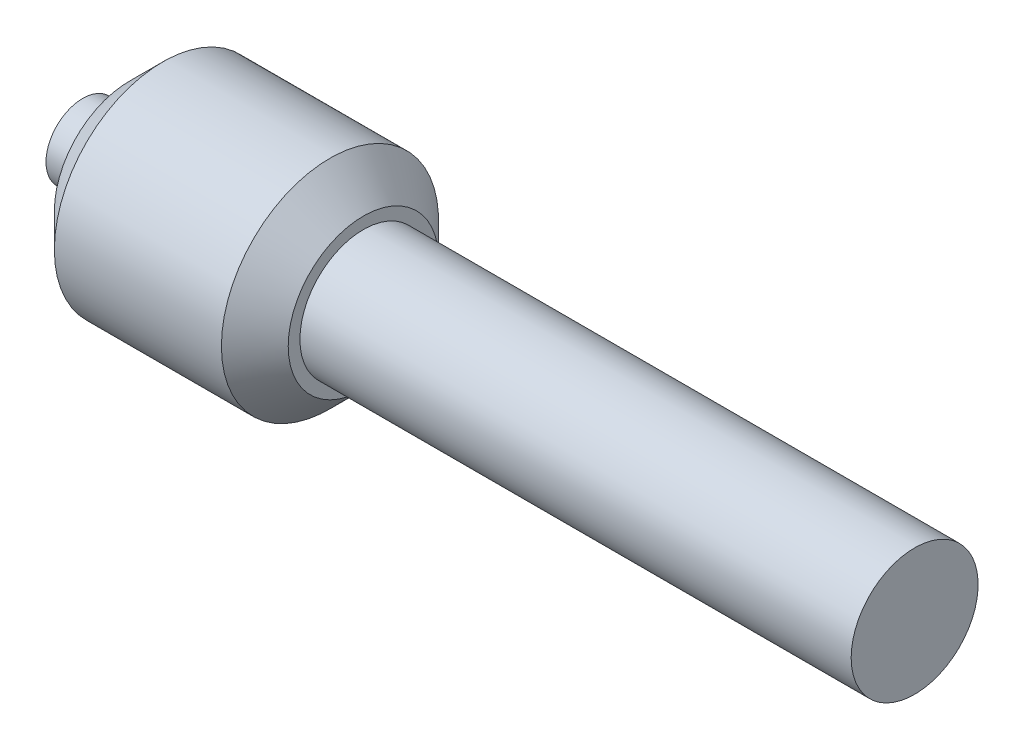
ISO-10303-21;
HEADER;
FILE_DESCRIPTION(('STEP AP214'),'2;1');
FILE_NAME('part.step','',(''),(''),'','','');
FILE_SCHEMA(('AUTOMOTIVE_DESIGN { 1 0 10303 214 1 1 1 1 }'));
ENDSEC;
DATA;
#1=APPLICATION_CONTEXT('core data for automotive mechanical design processes');
#2=APPLICATION_PROTOCOL_DEFINITION('international standard','automotive_design',2000,#1);
#3=PRODUCT_CONTEXT('',#1,'mechanical');
#4=PRODUCT('Part','Part','',(#3));
#5=PRODUCT_RELATED_PRODUCT_CATEGORY('part','',(#4));
#6=PRODUCT_DEFINITION_FORMATION('','',#4);
#7=PRODUCT_DEFINITION_CONTEXT('part definition',#1,'design');
#8=PRODUCT_DEFINITION('design','',#6,#7);
#9=PRODUCT_DEFINITION_SHAPE('','',#8);
#10=(LENGTH_UNIT() NAMED_UNIT(*) SI_UNIT(.MILLI.,.METRE.));
#11=(NAMED_UNIT(*) PLANE_ANGLE_UNIT() SI_UNIT($,.RADIAN.));
#12=(NAMED_UNIT(*) SI_UNIT($,.STERADIAN.) SOLID_ANGLE_UNIT());
#13=UNCERTAINTY_MEASURE_WITH_UNIT(LENGTH_MEASURE(1.E-05),#10,'distance_accuracy_value','');
#14=(GEOMETRIC_REPRESENTATION_CONTEXT(3) GLOBAL_UNCERTAINTY_ASSIGNED_CONTEXT((#13)) GLOBAL_UNIT_ASSIGNED_CONTEXT((#10,
#11,#12)) REPRESENTATION_CONTEXT('',''));
#15=CARTESIAN_POINT('',(0.,0.,0.));
#16=DIRECTION('',(0.,0.,1.));
#17=DIRECTION('',(1.,0.,0.));
#18=AXIS2_PLACEMENT_3D('',#15,#16,#17);
#19=CARTESIAN_POINT('',(0.,11.,0.));
#20=DIRECTION('',(1.,0.,0.));
#21=DIRECTION('',(0.,0.,-1.));
#22=AXIS2_PLACEMENT_3D('',#19,#20,#21);
#23=PLANE('',#22);
#24=CARTESIAN_POINT('',(0.,0.,0.));
#25=DIRECTION('',(-1.,0.,0.));
#26=DIRECTION('',(0.,0.,1.));
#27=AXIS2_PLACEMENT_3D('',#24,#25,#26);
#28=CIRCLE('',#27,6.025);
#29=CARTESIAN_POINT('',(0.,0.,6.025));
#30=VERTEX_POINT('',#29);
#31=EDGE_CURVE('E69',#30,#30,#28,.T.);
#32=ORIENTED_EDGE('',*,*,#31,.F.);
#33=EDGE_LOOP('',(#32));
#34=FACE_BOUND('',#33,.T.);
#35=CARTESIAN_POINT('',(0.,0.,0.));
#36=DIRECTION('',(-1.,0.,0.));
#37=DIRECTION('',(0.,0.,1.));
#38=AXIS2_PLACEMENT_3D('',#35,#36,#37);
#39=CIRCLE('',#38,11.);
#40=CARTESIAN_POINT('',(0.,0.,11.));
#41=VERTEX_POINT('',#40);
#42=EDGE_CURVE('E11',#41,#41,#39,.T.);
#43=ORIENTED_EDGE('',*,*,#42,.T.);
#44=EDGE_LOOP('',(#43));
#45=FACE_BOUND('',#44,.T.);
#46=ADVANCED_FACE('F43',(#34,#45),#23,.F.);
#47=CARTESIAN_POINT('',(0.,0.,0.));
#48=DIRECTION('',(-1.,0.,0.));
#49=DIRECTION('',(0.,0.,1.));
#50=AXIS2_PLACEMENT_3D('',#47,#48,#49);
#51=CYLINDRICAL_SURFACE('',#50,11.);
#52=ORIENTED_EDGE('',*,*,#42,.F.);
#53=EDGE_LOOP('',(#52));
#54=FACE_BOUND('',#53,.T.);
#55=CARTESIAN_POINT('',(14.,0.,0.));
#56=DIRECTION('',(-1.,0.,0.));
#57=DIRECTION('',(0.,0.,1.));
#58=AXIS2_PLACEMENT_3D('',#55,#56,#57);
#59=CIRCLE('',#58,11.);
#60=CARTESIAN_POINT('',(14.,0.,11.));
#61=VERTEX_POINT('',#60);
#62=EDGE_CURVE('E49',#61,#61,#59,.T.);
#63=ORIENTED_EDGE('',*,*,#62,.T.);
#64=EDGE_LOOP('',(#63));
#65=FACE_BOUND('',#64,.T.);
#66=ADVANCED_FACE('F89',(#54,#65),#51,.T.);
#67=CARTESIAN_POINT('',(14.,11.,0.));
#68=DIRECTION('',(1.,0.,0.));
#69=DIRECTION('',(0.,0.,-1.));
#70=AXIS2_PLACEMENT_3D('',#67,#68,#69);
#71=PLANE('',#70);
#72=ORIENTED_EDGE('',*,*,#62,.F.);
#73=EDGE_LOOP('',(#72));
#74=FACE_BOUND('',#73,.T.);
#75=CARTESIAN_POINT('',(14.,0.,0.));
#76=DIRECTION('',(-1.,0.,0.));
#77=DIRECTION('',(0.,0.,1.));
#78=AXIS2_PLACEMENT_3D('',#75,#76,#77);
#79=CIRCLE('',#78,22.5);
#80=CARTESIAN_POINT('',(14.,0.,22.5));
#81=VERTEX_POINT('',#80);
#82=EDGE_CURVE('E84',#81,#81,#79,.T.);
#83=ORIENTED_EDGE('',*,*,#82,.T.);
#84=EDGE_LOOP('',(#83));
#85=FACE_BOUND('',#84,.T.);
#86=ADVANCED_FACE('F91',(#74,#85),#71,.F.);
#87=CARTESIAN_POINT('',(24.,0.,0.));
#88=DIRECTION('',(1.,0.,0.));
#89=DIRECTION('',(0.,0.,-1.));
#90=AXIS2_PLACEMENT_3D('',#87,#88,#89);
#91=CONICAL_SURFACE('',#90,32.5,0.785398163397448);
#92=ORIENTED_EDGE('',*,*,#82,.F.);
#93=EDGE_LOOP('',(#92));
#94=FACE_BOUND('',#93,.T.);
#95=CARTESIAN_POINT('',(24.,0.,0.));
#96=DIRECTION('',(-1.,0.,0.));
#97=DIRECTION('',(0.,0.,1.));
#98=AXIS2_PLACEMENT_3D('',#95,#96,#97);
#99=CIRCLE('',#98,32.5);
#100=CARTESIAN_POINT('',(24.,0.,32.5));
#101=VERTEX_POINT('',#100);
#102=EDGE_CURVE('E81',#101,#101,#99,.T.);
#103=ORIENTED_EDGE('',*,*,#102,.T.);
#104=EDGE_LOOP('',(#103));
#105=FACE_BOUND('',#104,.T.);
#106=ADVANCED_FACE('F94',(#94,#105),#91,.T.);
#107=CARTESIAN_POINT('',(0.,0.,0.));
#108=DIRECTION('',(-1.,0.,0.));
#109=DIRECTION('',(0.,0.,1.));
#110=AXIS2_PLACEMENT_3D('',#107,#108,#109);
#111=CYLINDRICAL_SURFACE('',#110,32.5);
#112=ORIENTED_EDGE('',*,*,#102,.F.);
#113=EDGE_LOOP('',(#112));
#114=FACE_BOUND('',#113,.T.);
#115=CARTESIAN_POINT('',(74.,0.,0.));
#116=DIRECTION('',(-1.,0.,0.));
#117=DIRECTION('',(0.,0.,1.));
#118=AXIS2_PLACEMENT_3D('',#115,#116,#117);
#119=CIRCLE('',#118,32.5);
#120=CARTESIAN_POINT('',(74.,0.,32.5));
#121=VERTEX_POINT('',#120);
#122=EDGE_CURVE('E78',#121,#121,#119,.T.);
#123=ORIENTED_EDGE('',*,*,#122,.T.);
#124=EDGE_LOOP('',(#123));
#125=FACE_BOUND('',#124,.T.);
#126=ADVANCED_FACE('F100',(#114,#125),#111,.T.);
#127=CARTESIAN_POINT('',(84.,0.,0.));
#128=DIRECTION('',(-1.,0.,0.));
#129=DIRECTION('',(0.,0.,1.));
#130=AXIS2_PLACEMENT_3D('',#127,#128,#129);
#131=CONICAL_SURFACE('',#130,22.5,0.785398163397448);
#132=ORIENTED_EDGE('',*,*,#122,.F.);
#133=EDGE_LOOP('',(#132));
#134=FACE_BOUND('',#133,.T.);
#135=CARTESIAN_POINT('',(84.,0.,0.));
#136=DIRECTION('',(-1.,0.,0.));
#137=DIRECTION('',(0.,0.,1.));
#138=AXIS2_PLACEMENT_3D('',#135,#136,#137);
#139=CIRCLE('',#138,22.5);
#140=CARTESIAN_POINT('',(84.,0.,22.5));
#141=VERTEX_POINT('',#140);
#142=EDGE_CURVE('E75',#141,#141,#139,.T.);
#143=ORIENTED_EDGE('',*,*,#142,.T.);
#144=EDGE_LOOP('',(#143));
#145=FACE_BOUND('',#144,.T.);
#146=ADVANCED_FACE('F106',(#134,#145),#131,.T.);
#147=CARTESIAN_POINT('',(84.,22.5,0.));
#148=DIRECTION('',(-1.,0.,0.));
#149=DIRECTION('',(0.,0.,1.));
#150=AXIS2_PLACEMENT_3D('',#147,#148,#149);
#151=PLANE('',#150);
#152=ORIENTED_EDGE('',*,*,#142,.F.);
#153=EDGE_LOOP('',(#152));
#154=FACE_BOUND('',#153,.T.);
#155=CARTESIAN_POINT('',(84.,0.,0.));
#156=DIRECTION('',(-1.,0.,0.));
#157=DIRECTION('',(0.,0.,1.));
#158=AXIS2_PLACEMENT_3D('',#155,#156,#157);
#159=CIRCLE('',#158,19.);
#160=CARTESIAN_POINT('',(84.,0.,19.));
#161=VERTEX_POINT('',#160);
#162=EDGE_CURVE('E66',#161,#161,#159,.T.);
#163=ORIENTED_EDGE('',*,*,#162,.T.);
#164=EDGE_LOOP('',(#163));
#165=FACE_BOUND('',#164,.T.);
#166=ADVANCED_FACE('F112',(#154,#165),#151,.F.);
#167=CARTESIAN_POINT('',(0.,0.,0.));
#168=DIRECTION('',(-1.,0.,0.));
#169=DIRECTION('',(0.,0.,1.));
#170=AXIS2_PLACEMENT_3D('',#167,#168,#169);
#171=CYLINDRICAL_SURFACE('',#170,19.);
#172=ORIENTED_EDGE('',*,*,#162,.F.);
#173=EDGE_LOOP('',(#172));
#174=FACE_BOUND('',#173,.T.);
#175=CARTESIAN_POINT('',(249.,0.,0.));
#176=DIRECTION('',(-1.,0.,0.));
#177=DIRECTION('',(0.,0.,1.));
#178=AXIS2_PLACEMENT_3D('',#175,#176,#177);
#179=CIRCLE('',#178,19.);
#180=CARTESIAN_POINT('',(249.,0.,19.));
#181=VERTEX_POINT('',#180);
#182=EDGE_CURVE('E62',#181,#181,#179,.T.);
#183=ORIENTED_EDGE('',*,*,#182,.T.);
#184=EDGE_LOOP('',(#183));
#185=FACE_BOUND('',#184,.T.);
#186=ADVANCED_FACE('F118',(#174,#185),#171,.T.);
#187=CARTESIAN_POINT('',(249.,19.,0.));
#188=DIRECTION('',(-1.,0.,0.));
#189=DIRECTION('',(0.,0.,1.));
#190=AXIS2_PLACEMENT_3D('',#187,#188,#189);
#191=PLANE('',#190);
#192=ORIENTED_EDGE('',*,*,#182,.F.);
#193=EDGE_LOOP('',(#192));
#194=FACE_BOUND('',#193,.T.);
#195=ADVANCED_FACE('F56',(#194),#191,.F.);
#196=CARTESIAN_POINT('',(24.8454817501053,0.,0.));
#197=DIRECTION('',(-1.,0.,0.));
#198=DIRECTION('',(0.,0.,1.));
#199=AXIS2_PLACEMENT_3D('',#196,#197,#198);
#200=CONICAL_SURFACE('',#199,5.24999999999999,1.02974425867665);
#201=CARTESIAN_POINT('',(28.,0.,0.));
#202=VERTEX_POINT('',#201);
#203=VERTEX_LOOP('',#202);
#204=FACE_BOUND('',#203,.T.);
#205=CARTESIAN_POINT('',(24.8454817501053,0.,0.));
#206=DIRECTION('',(-1.,0.,0.));
#207=DIRECTION('',(0.,0.,1.));
#208=AXIS2_PLACEMENT_3D('',#205,#206,#207);
#209=CIRCLE('',#208,5.24999999999999);
#210=CARTESIAN_POINT('',(24.8454817501053,0.,5.24999999999999));
#211=VERTEX_POINT('',#210);
#212=EDGE_CURVE('E60',#211,#211,#209,.T.);
#213=ORIENTED_EDGE('',*,*,#212,.T.);
#214=EDGE_LOOP('',(#213));
#215=FACE_BOUND('',#214,.T.);
#216=ADVANCED_FACE('F52',(#204,#215),#200,.F.);
#217=CARTESIAN_POINT('',(0.,0.,0.));
#218=DIRECTION('',(-1.,0.,0.));
#219=DIRECTION('',(0.,0.,1.));
#220=AXIS2_PLACEMENT_3D('',#217,#218,#219);
#221=CYLINDRICAL_SURFACE('',#220,5.25);
#222=ORIENTED_EDGE('',*,*,#212,.F.);
#223=EDGE_LOOP('',(#222));
#224=FACE_BOUND('',#223,.T.);
#225=CARTESIAN_POINT('',(0.775000000000005,0.,0.));
#226=DIRECTION('',(-1.,0.,0.));
#227=DIRECTION('',(0.,0.,1.));
#228=AXIS2_PLACEMENT_3D('',#225,#226,#227);
#229=CIRCLE('',#228,5.25);
#230=CARTESIAN_POINT('',(0.775000000000005,0.,5.25));
#231=VERTEX_POINT('',#230);
#232=EDGE_CURVE('E63',#231,#231,#229,.T.);
#233=ORIENTED_EDGE('',*,*,#232,.T.);
#234=EDGE_LOOP('',(#233));
#235=FACE_BOUND('',#234,.T.);
#236=ADVANCED_FACE('F55',(#224,#235),#221,.F.);
#237=CARTESIAN_POINT('',(0.,0.,0.));
#238=DIRECTION('',(-1.,0.,0.));
#239=DIRECTION('',(0.,0.,1.));
#240=AXIS2_PLACEMENT_3D('',#237,#238,#239);
#241=CONICAL_SURFACE('',#240,6.025,0.785398163397447);
#242=ORIENTED_EDGE('',*,*,#232,.F.);
#243=EDGE_LOOP('',(#242));
#244=FACE_BOUND('',#243,.T.);
#245=ORIENTED_EDGE('',*,*,#31,.T.);
#246=EDGE_LOOP('',(#245));
#247=FACE_BOUND('',#246,.T.);
#248=ADVANCED_FACE('F142',(#244,#247),#241,.F.);
#249=CLOSED_SHELL('',(#46,#66,#86,#106,#126,#146,#166,#186,#195,#216,#236,#248));
#250=MANIFOLD_SOLID_BREP('B2',#249);
#251=ADVANCED_BREP_SHAPE_REPRESENTATION('',(#18,#250),#14);
#252=SHAPE_DEFINITION_REPRESENTATION(#9,#251);
ENDSEC;
END-ISO-10303-21;
